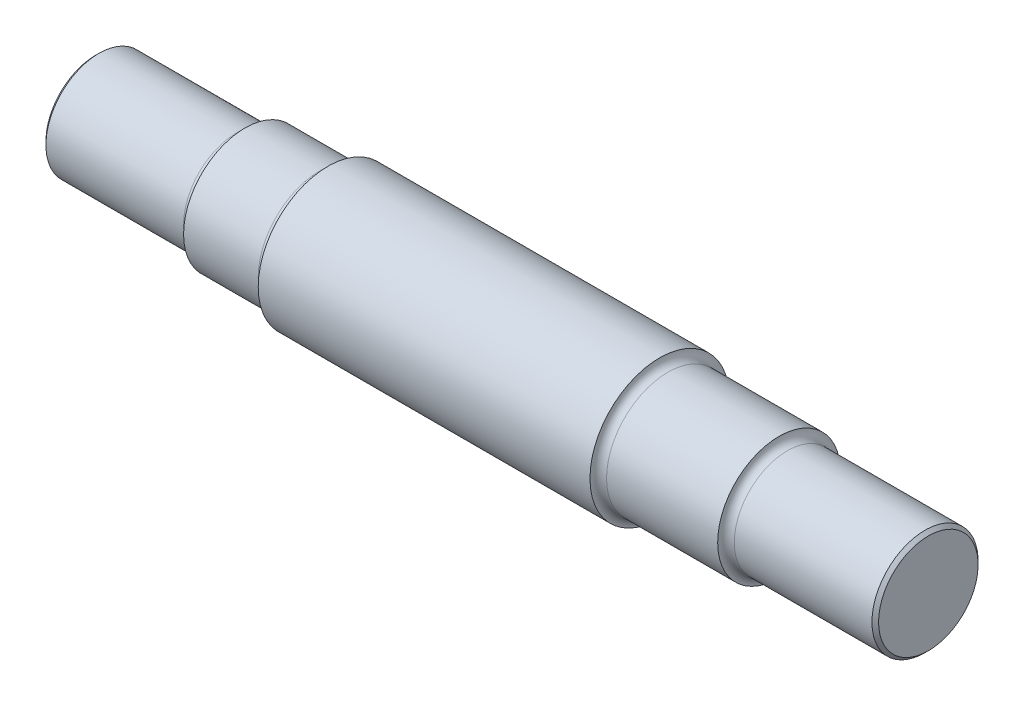
ISO-10303-21;
HEADER;
FILE_DESCRIPTION(('STEP AP214'),'2;1');
FILE_NAME('part.step','',(''),(''),'','','');
FILE_SCHEMA(('AUTOMOTIVE_DESIGN { 1 0 10303 214 1 1 1 1 }'));
ENDSEC;
DATA;
#1=APPLICATION_CONTEXT('core data for automotive mechanical design processes');
#2=APPLICATION_PROTOCOL_DEFINITION('international standard','automotive_design',2000,#1);
#3=PRODUCT_CONTEXT('',#1,'mechanical');
#4=PRODUCT('Part','Part','',(#3));
#5=PRODUCT_RELATED_PRODUCT_CATEGORY('part','',(#4));
#6=PRODUCT_DEFINITION_FORMATION('','',#4);
#7=PRODUCT_DEFINITION_CONTEXT('part definition',#1,'design');
#8=PRODUCT_DEFINITION('design','',#6,#7);
#9=PRODUCT_DEFINITION_SHAPE('','',#8);
#10=(LENGTH_UNIT() NAMED_UNIT(*) SI_UNIT(.MILLI.,.METRE.));
#11=(NAMED_UNIT(*) PLANE_ANGLE_UNIT() SI_UNIT($,.RADIAN.));
#12=(NAMED_UNIT(*) SI_UNIT($,.STERADIAN.) SOLID_ANGLE_UNIT());
#13=UNCERTAINTY_MEASURE_WITH_UNIT(LENGTH_MEASURE(1.E-05),#10,'distance_accuracy_value','');
#14=(GEOMETRIC_REPRESENTATION_CONTEXT(3) GLOBAL_UNCERTAINTY_ASSIGNED_CONTEXT((#13)) GLOBAL_UNIT_ASSIGNED_CONTEXT((#10,
#11,#12)) REPRESENTATION_CONTEXT('',''));
#15=CARTESIAN_POINT('',(0.,0.,0.));
#16=DIRECTION('',(0.,0.,1.));
#17=DIRECTION('',(1.,0.,0.));
#18=AXIS2_PLACEMENT_3D('',#15,#16,#17);
#19=CARTESIAN_POINT('',(0.,0.,0.));
#20=DIRECTION('',(1.,0.,0.));
#21=DIRECTION('',(0.,0.,-1.));
#22=AXIS2_PLACEMENT_3D('',#19,#20,#21);
#23=PLANE('',#22);
#24=CARTESIAN_POINT('',(0.,0.,0.));
#25=DIRECTION('',(1.,0.,0.));
#26=DIRECTION('',(0.,0.,-1.));
#27=AXIS2_PLACEMENT_3D('',#24,#25,#26);
#28=CIRCLE('',#27,15.);
#29=CARTESIAN_POINT('',(0.,0.,-15.));
#30=VERTEX_POINT('',#29);
#31=EDGE_CURVE('E38',#30,#30,#28,.F.);
#32=ORIENTED_EDGE('',*,*,#31,.T.);
#33=EDGE_LOOP('',(#32));
#34=FACE_BOUND('',#33,.T.);
#35=ADVANCED_FACE('F31',(#34),#23,.F.);
#36=CARTESIAN_POINT('',(0.,0.,0.));
#37=DIRECTION('',(-1.,0.,0.));
#38=DIRECTION('',(0.,0.,1.));
#39=AXIS2_PLACEMENT_3D('',#36,#37,#38);
#40=CYLINDRICAL_SURFACE('',#39,16.);
#41=CARTESIAN_POINT('',(1.00000000000004,0.,0.));
#42=DIRECTION('',(1.,0.,0.));
#43=DIRECTION('',(0.,0.,-1.));
#44=AXIS2_PLACEMENT_3D('',#41,#42,#43);
#45=CIRCLE('',#44,16.);
#46=CARTESIAN_POINT('',(1.00000000000004,0.,-16.));
#47=VERTEX_POINT('',#46);
#48=EDGE_CURVE('E10',#47,#47,#45,.T.);
#49=ORIENTED_EDGE('',*,*,#48,.T.);
#50=EDGE_LOOP('',(#49));
#51=FACE_BOUND('',#50,.T.);
#52=CARTESIAN_POINT('',(42.5,0.,0.));
#53=DIRECTION('',(1.,0.,0.));
#54=DIRECTION('',(0.,0.,-1.));
#55=AXIS2_PLACEMENT_3D('',#52,#53,#54);
#56=CIRCLE('',#55,16.);
#57=CARTESIAN_POINT('',(42.5,0.,-16.));
#58=VERTEX_POINT('',#57);
#59=EDGE_CURVE('E51',#58,#58,#56,.F.);
#60=ORIENTED_EDGE('',*,*,#59,.T.);
#61=EDGE_LOOP('',(#60));
#62=FACE_BOUND('',#61,.T.);
#63=ADVANCED_FACE('F97',(#51,#62),#40,.T.);
#64=CARTESIAN_POINT('',(0.,0.,0.));
#65=DIRECTION('',(-1.,0.,0.));
#66=DIRECTION('',(0.,0.,1.));
#67=AXIS2_PLACEMENT_3D('',#64,#65,#66);
#68=CYLINDRICAL_SURFACE('',#67,18.5);
#69=CARTESIAN_POINT('',(67.5,0.,0.));
#70=DIRECTION('',(1.,0.,0.));
#71=DIRECTION('',(0.,0.,-1.));
#72=AXIS2_PLACEMENT_3D('',#69,#70,#71);
#73=CIRCLE('',#72,18.5);
#74=CARTESIAN_POINT('',(67.5,0.,-18.5));
#75=VERTEX_POINT('',#74);
#76=EDGE_CURVE('E54',#75,#75,#73,.F.);
#77=ORIENTED_EDGE('',*,*,#76,.T.);
#78=EDGE_LOOP('',(#77));
#79=FACE_BOUND('',#78,.T.);
#80=CARTESIAN_POINT('',(45.,0.,0.));
#81=DIRECTION('',(-1.,0.,0.));
#82=DIRECTION('',(0.,0.,1.));
#83=AXIS2_PLACEMENT_3D('',#80,#81,#82);
#84=CIRCLE('',#83,18.5);
#85=CARTESIAN_POINT('',(45.,0.,18.5));
#86=VERTEX_POINT('',#85);
#87=EDGE_CURVE('E63',#86,#86,#84,.T.);
#88=ORIENTED_EDGE('',*,*,#87,.F.);
#89=EDGE_LOOP('',(#88));
#90=FACE_BOUND('',#89,.T.);
#91=ADVANCED_FACE('F101',(#79,#90),#68,.T.);
#92=CARTESIAN_POINT('',(0.,0.,0.));
#93=DIRECTION('',(-1.,0.,0.));
#94=DIRECTION('',(0.,0.,1.));
#95=AXIS2_PLACEMENT_3D('',#92,#93,#94);
#96=CYLINDRICAL_SURFACE('',#95,21.);
#97=CARTESIAN_POINT('',(70.,0.,0.));
#98=DIRECTION('',(-1.,0.,0.));
#99=DIRECTION('',(0.,0.,1.));
#100=AXIS2_PLACEMENT_3D('',#97,#98,#99);
#101=CIRCLE('',#100,21.);
#102=CARTESIAN_POINT('',(70.,0.,21.));
#103=VERTEX_POINT('',#102);
#104=EDGE_CURVE('E66',#103,#103,#101,.T.);
#105=ORIENTED_EDGE('',*,*,#104,.F.);
#106=EDGE_LOOP('',(#105));
#107=FACE_BOUND('',#106,.T.);
#108=CARTESIAN_POINT('',(170.,0.,0.));
#109=DIRECTION('',(-1.,0.,0.));
#110=DIRECTION('',(0.,0.,1.));
#111=AXIS2_PLACEMENT_3D('',#108,#109,#110);
#112=CIRCLE('',#111,21.);
#113=CARTESIAN_POINT('',(170.,0.,21.));
#114=VERTEX_POINT('',#113);
#115=EDGE_CURVE('E69',#114,#114,#112,.T.);
#116=ORIENTED_EDGE('',*,*,#115,.T.);
#117=EDGE_LOOP('',(#116));
#118=FACE_BOUND('',#117,.T.);
#119=ADVANCED_FACE('F106',(#107,#118),#96,.T.);
#120=CARTESIAN_POINT('',(0.,0.,0.));
#121=DIRECTION('',(-1.,0.,0.));
#122=DIRECTION('',(0.,0.,1.));
#123=AXIS2_PLACEMENT_3D('',#120,#121,#122);
#124=CYLINDRICAL_SURFACE('',#123,18.5);
#125=CARTESIAN_POINT('',(172.5,0.,0.));
#126=DIRECTION('',(-1.,0.,0.));
#127=DIRECTION('',(0.,0.,1.));
#128=AXIS2_PLACEMENT_3D('',#125,#126,#127);
#129=CIRCLE('',#128,18.5);
#130=CARTESIAN_POINT('',(172.5,0.,18.5));
#131=VERTEX_POINT('',#130);
#132=EDGE_CURVE('E57',#131,#131,#129,.F.);
#133=ORIENTED_EDGE('',*,*,#132,.T.);
#134=EDGE_LOOP('',(#133));
#135=FACE_BOUND('',#134,.T.);
#136=CARTESIAN_POINT('',(206.,0.,0.));
#137=DIRECTION('',(-1.,0.,0.));
#138=DIRECTION('',(0.,0.,1.));
#139=AXIS2_PLACEMENT_3D('',#136,#137,#138);
#140=CIRCLE('',#139,18.5);
#141=CARTESIAN_POINT('',(206.,0.,18.5));
#142=VERTEX_POINT('',#141);
#143=EDGE_CURVE('E72',#142,#142,#140,.T.);
#144=ORIENTED_EDGE('',*,*,#143,.T.);
#145=EDGE_LOOP('',(#144));
#146=FACE_BOUND('',#145,.T.);
#147=ADVANCED_FACE('F76',(#135,#146),#124,.T.);
#148=CARTESIAN_POINT('',(0.,0.,0.));
#149=DIRECTION('',(-1.,0.,0.));
#150=DIRECTION('',(0.,0.,1.));
#151=AXIS2_PLACEMENT_3D('',#148,#149,#150);
#152=CYLINDRICAL_SURFACE('',#151,16.);
#153=CARTESIAN_POINT('',(250.,0.,0.));
#154=DIRECTION('',(-1.,0.,0.));
#155=DIRECTION('',(0.,0.,1.));
#156=AXIS2_PLACEMENT_3D('',#153,#154,#155);
#157=CIRCLE('',#156,16.);
#158=CARTESIAN_POINT('',(250.,0.,16.));
#159=VERTEX_POINT('',#158);
#160=EDGE_CURVE('E46',#159,#159,#157,.T.);
#161=ORIENTED_EDGE('',*,*,#160,.T.);
#162=EDGE_LOOP('',(#161));
#163=FACE_BOUND('',#162,.T.);
#164=CARTESIAN_POINT('',(208.5,0.,0.));
#165=DIRECTION('',(-1.,0.,0.));
#166=DIRECTION('',(0.,0.,1.));
#167=AXIS2_PLACEMENT_3D('',#164,#165,#166);
#168=CIRCLE('',#167,16.);
#169=CARTESIAN_POINT('',(208.5,0.,16.));
#170=VERTEX_POINT('',#169);
#171=EDGE_CURVE('E60',#170,#170,#168,.F.);
#172=ORIENTED_EDGE('',*,*,#171,.T.);
#173=EDGE_LOOP('',(#172));
#174=FACE_BOUND('',#173,.T.);
#175=ADVANCED_FACE('F91',(#163,#174),#152,.T.);
#176=CARTESIAN_POINT('',(251.,16.,0.));
#177=DIRECTION('',(-1.,0.,0.));
#178=DIRECTION('',(0.,0.,1.));
#179=AXIS2_PLACEMENT_3D('',#176,#177,#178);
#180=PLANE('',#179);
#181=CARTESIAN_POINT('',(251.,0.,0.));
#182=DIRECTION('',(-1.,0.,0.));
#183=DIRECTION('',(0.,0.,1.));
#184=AXIS2_PLACEMENT_3D('',#181,#182,#183);
#185=CIRCLE('',#184,15.);
#186=CARTESIAN_POINT('',(251.,0.,15.));
#187=VERTEX_POINT('',#186);
#188=EDGE_CURVE('E42',#187,#187,#185,.F.);
#189=ORIENTED_EDGE('',*,*,#188,.T.);
#190=EDGE_LOOP('',(#189));
#191=FACE_BOUND('',#190,.T.);
#192=ADVANCED_FACE('F81',(#191),#180,.F.);
#193=CARTESIAN_POINT('',(208.5,0.,0.));
#194=DIRECTION('',(-1.,0.,0.));
#195=DIRECTION('',(0.,0.,1.));
#196=AXIS2_PLACEMENT_3D('',#193,#194,#195);
#197=TOROIDAL_SURFACE('',#196,18.5,2.5);
#198=ORIENTED_EDGE('',*,*,#171,.F.);
#199=EDGE_LOOP('',(#198));
#200=FACE_BOUND('',#199,.T.);
#201=ORIENTED_EDGE('',*,*,#143,.F.);
#202=EDGE_LOOP('',(#201));
#203=FACE_BOUND('',#202,.T.);
#204=ADVANCED_FACE('F78',(#200,#203),#197,.F.);
#205=CARTESIAN_POINT('',(172.5,0.,0.));
#206=DIRECTION('',(-1.,0.,0.));
#207=DIRECTION('',(0.,0.,1.));
#208=AXIS2_PLACEMENT_3D('',#205,#206,#207);
#209=TOROIDAL_SURFACE('',#208,21.,2.5);
#210=ORIENTED_EDGE('',*,*,#132,.F.);
#211=EDGE_LOOP('',(#210));
#212=FACE_BOUND('',#211,.T.);
#213=ORIENTED_EDGE('',*,*,#115,.F.);
#214=EDGE_LOOP('',(#213));
#215=FACE_BOUND('',#214,.T.);
#216=ADVANCED_FACE('F80',(#212,#215),#209,.F.);
#217=CARTESIAN_POINT('',(67.5,0.,0.));
#218=DIRECTION('',(1.,0.,0.));
#219=DIRECTION('',(0.,0.,-1.));
#220=AXIS2_PLACEMENT_3D('',#217,#218,#219);
#221=TOROIDAL_SURFACE('',#220,21.,2.5);
#222=ORIENTED_EDGE('',*,*,#104,.T.);
#223=EDGE_LOOP('',(#222));
#224=FACE_BOUND('',#223,.T.);
#225=ORIENTED_EDGE('',*,*,#76,.F.);
#226=EDGE_LOOP('',(#225));
#227=FACE_BOUND('',#226,.T.);
#228=ADVANCED_FACE('F88',(#224,#227),#221,.F.);
#229=CARTESIAN_POINT('',(42.5,0.,0.));
#230=DIRECTION('',(1.,0.,0.));
#231=DIRECTION('',(0.,0.,-1.));
#232=AXIS2_PLACEMENT_3D('',#229,#230,#231);
#233=TOROIDAL_SURFACE('',#232,18.5,2.5);
#234=ORIENTED_EDGE('',*,*,#87,.T.);
#235=EDGE_LOOP('',(#234));
#236=FACE_BOUND('',#235,.T.);
#237=ORIENTED_EDGE('',*,*,#59,.F.);
#238=EDGE_LOOP('',(#237));
#239=FACE_BOUND('',#238,.T.);
#240=ADVANCED_FACE('F123',(#236,#239),#233,.F.);
#241=CARTESIAN_POINT('',(250.,0.,0.));
#242=DIRECTION('',(-1.,0.,0.));
#243=DIRECTION('',(0.,0.,1.));
#244=AXIS2_PLACEMENT_3D('',#241,#242,#243);
#245=CONICAL_SURFACE('',#244,16.,0.785398163397414);
#246=ORIENTED_EDGE('',*,*,#188,.F.);
#247=EDGE_LOOP('',(#246));
#248=FACE_BOUND('',#247,.T.);
#249=ORIENTED_EDGE('',*,*,#160,.F.);
#250=EDGE_LOOP('',(#249));
#251=FACE_BOUND('',#250,.T.);
#252=ADVANCED_FACE('F121',(#248,#251),#245,.T.);
#253=CARTESIAN_POINT('',(0.,0.,0.));
#254=DIRECTION('',(1.,0.,0.));
#255=DIRECTION('',(0.,0.,-1.));
#256=AXIS2_PLACEMENT_3D('',#253,#254,#255);
#257=CONICAL_SURFACE('',#256,15.,0.785398163397448);
#258=ORIENTED_EDGE('',*,*,#48,.F.);
#259=EDGE_LOOP('',(#258));
#260=FACE_BOUND('',#259,.T.);
#261=ORIENTED_EDGE('',*,*,#31,.F.);
#262=EDGE_LOOP('',(#261));
#263=FACE_BOUND('',#262,.T.);
#264=ADVANCED_FACE('F33',(#260,#263),#257,.T.);
#265=CLOSED_SHELL('',(#35,#63,#91,#119,#147,#175,#192,#204,#216,#228,#240,#252,#264));
#266=MANIFOLD_SOLID_BREP('B2',#265);
#267=ADVANCED_BREP_SHAPE_REPRESENTATION('',(#18,#266),#14);
#268=SHAPE_DEFINITION_REPRESENTATION(#9,#267);
ENDSEC;
END-ISO-10303-21;
